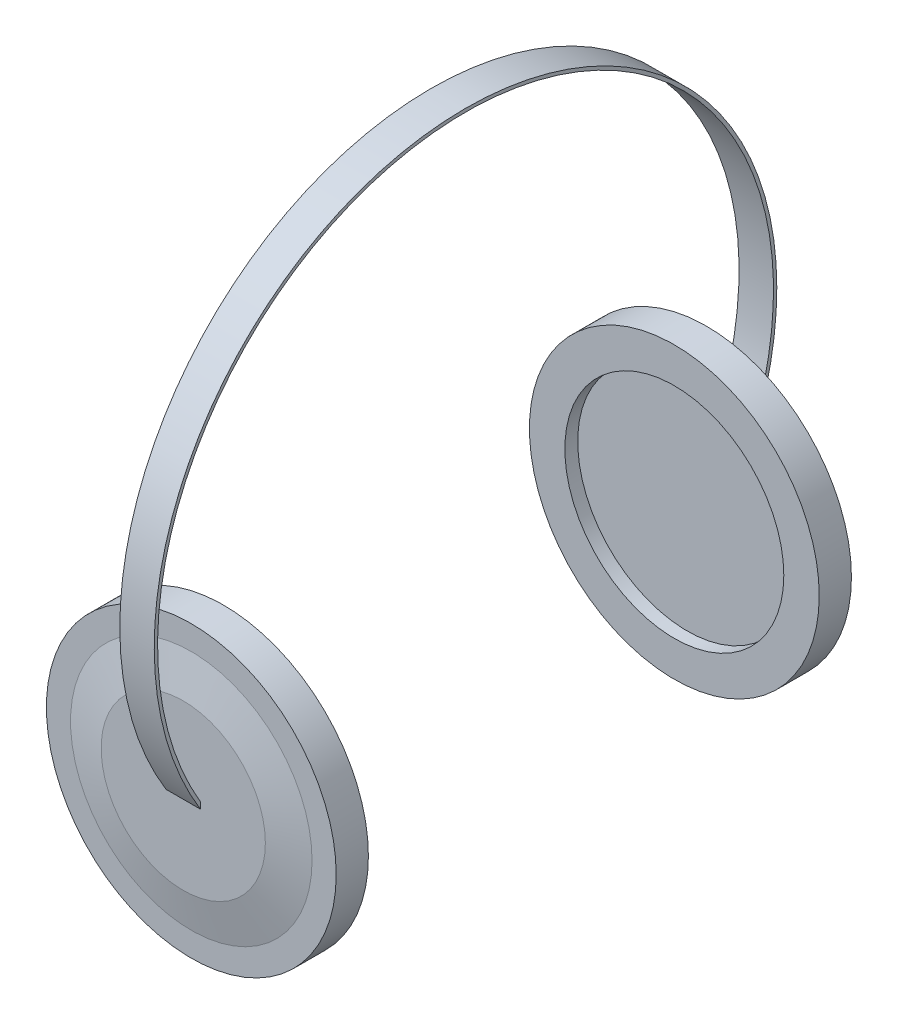
ISO-10303-21;
HEADER;
FILE_DESCRIPTION(('STEP AP214'),'2;1');
FILE_NAME('part.step','',(''),(''),'','','');
FILE_SCHEMA(('AUTOMOTIVE_DESIGN { 1 0 10303 214 1 1 1 1 }'));
ENDSEC;
DATA;
#1=APPLICATION_CONTEXT('core data for automotive mechanical design processes');
#2=APPLICATION_PROTOCOL_DEFINITION('international standard','automotive_design',2000,#1);
#3=PRODUCT_CONTEXT('',#1,'mechanical');
#4=PRODUCT('Part','Part','',(#3));
#5=PRODUCT_RELATED_PRODUCT_CATEGORY('part','',(#4));
#6=PRODUCT_DEFINITION_FORMATION('','',#4);
#7=PRODUCT_DEFINITION_CONTEXT('part definition',#1,'design');
#8=PRODUCT_DEFINITION('design','',#6,#7);
#9=PRODUCT_DEFINITION_SHAPE('','',#8);
#10=(LENGTH_UNIT() NAMED_UNIT(*) SI_UNIT(.MILLI.,.METRE.));
#11=(NAMED_UNIT(*) PLANE_ANGLE_UNIT() SI_UNIT($,.RADIAN.));
#12=(NAMED_UNIT(*) SI_UNIT($,.STERADIAN.) SOLID_ANGLE_UNIT());
#13=UNCERTAINTY_MEASURE_WITH_UNIT(LENGTH_MEASURE(1.E-05),#10,'distance_accuracy_value','');
#14=(GEOMETRIC_REPRESENTATION_CONTEXT(3) GLOBAL_UNCERTAINTY_ASSIGNED_CONTEXT((#13)) GLOBAL_UNIT_ASSIGNED_CONTEXT((#10,
#11,#12)) REPRESENTATION_CONTEXT('',''));
#15=CARTESIAN_POINT('',(0.,0.,0.));
#16=DIRECTION('',(0.,0.,1.));
#17=DIRECTION('',(1.,0.,0.));
#18=AXIS2_PLACEMENT_3D('',#15,#16,#17);
#19=CARTESIAN_POINT('',(0.,0.,320.));
#20=DIRECTION('',(0.,0.,1.));
#21=DIRECTION('',(1.,0.,0.));
#22=AXIS2_PLACEMENT_3D('',#19,#20,#21);
#23=PLANE('',#22);
#24=CARTESIAN_POINT('',(0.,0.,320.));
#25=DIRECTION('',(0.,0.,1.));
#26=DIRECTION('',(1.,0.,0.));
#27=AXIS2_PLACEMENT_3D('',#24,#25,#26);
#28=CIRCLE('',#27,90.);
#29=CARTESIAN_POINT('',(90.,0.,320.));
#30=VERTEX_POINT('',#29);
#31=EDGE_CURVE('E49',#30,#30,#28,.T.);
#32=ORIENTED_EDGE('',*,*,#31,.T.);
#33=EDGE_LOOP('',(#32));
#34=FACE_BOUND('',#33,.T.);
#35=CARTESIAN_POINT('',(0.,0.,320.));
#36=DIRECTION('',(0.,0.,1.));
#37=DIRECTION('',(1.,0.,0.));
#38=AXIS2_PLACEMENT_3D('',#35,#36,#37);
#39=CIRCLE('',#38,75.);
#40=CARTESIAN_POINT('',(75.,0.,320.));
#41=VERTEX_POINT('',#40);
#42=EDGE_CURVE('E117',#41,#41,#39,.T.);
#43=ORIENTED_EDGE('',*,*,#42,.F.);
#44=EDGE_LOOP('',(#43));
#45=FACE_BOUND('',#44,.T.);
#46=ADVANCED_FACE('F41',(#34,#45),#23,.T.);
#47=CARTESIAN_POINT('',(0.,0.,320.));
#48=DIRECTION('',(0.,0.,-1.));
#49=DIRECTION('',(-1.,0.,0.));
#50=AXIS2_PLACEMENT_3D('',#47,#48,#49);
#51=CYLINDRICAL_SURFACE('',#50,90.);
#52=ORIENTED_EDGE('',*,*,#31,.F.);
#53=EDGE_LOOP('',(#52));
#54=FACE_BOUND('',#53,.T.);
#55=CARTESIAN_POINT('',(0.,0.,300.));
#56=DIRECTION('',(0.,0.,1.));
#57=DIRECTION('',(1.,0.,0.));
#58=AXIS2_PLACEMENT_3D('',#55,#56,#57);
#59=CIRCLE('',#58,90.);
#60=CARTESIAN_POINT('',(90.,0.,300.));
#61=VERTEX_POINT('',#60);
#62=EDGE_CURVE('E154',#61,#61,#59,.T.);
#63=ORIENTED_EDGE('',*,*,#62,.T.);
#64=EDGE_LOOP('',(#63));
#65=FACE_BOUND('',#64,.T.);
#66=ADVANCED_FACE('F43',(#54,#65),#51,.T.);
#67=CARTESIAN_POINT('',(0.,0.,300.));
#68=DIRECTION('',(0.,0.,1.));
#69=DIRECTION('',(1.,0.,0.));
#70=AXIS2_PLACEMENT_3D('',#67,#68,#69);
#71=PLANE('',#70);
#72=CARTESIAN_POINT('',(0.,0.,300.));
#73=DIRECTION('',(0.,0.,-1.));
#74=DIRECTION('',(-1.,0.,0.));
#75=AXIS2_PLACEMENT_3D('',#72,#73,#74);
#76=CIRCLE('',#75,68.);
#77=CARTESIAN_POINT('',(-68.,0.,300.));
#78=VERTEX_POINT('',#77);
#79=EDGE_CURVE('E155',#78,#78,#76,.T.);
#80=ORIENTED_EDGE('',*,*,#79,.F.);
#81=EDGE_LOOP('',(#80));
#82=FACE_BOUND('',#81,.T.);
#83=ORIENTED_EDGE('',*,*,#62,.F.);
#84=EDGE_LOOP('',(#83));
#85=FACE_BOUND('',#84,.T.);
#86=ADVANCED_FACE('F163',(#82,#85),#71,.F.);
#87=CARTESIAN_POINT('',(0.,0.,308.));
#88=DIRECTION('',(0.,0.,-1.));
#89=DIRECTION('',(-1.,0.,0.));
#90=AXIS2_PLACEMENT_3D('',#87,#88,#89);
#91=CYLINDRICAL_SURFACE('',#90,68.);
#92=CARTESIAN_POINT('',(0.,0.,308.));
#93=DIRECTION('',(0.,0.,-1.));
#94=DIRECTION('',(-1.,0.,0.));
#95=AXIS2_PLACEMENT_3D('',#92,#93,#94);
#96=CIRCLE('',#95,68.);
#97=CARTESIAN_POINT('',(-68.,0.,308.));
#98=VERTEX_POINT('',#97);
#99=EDGE_CURVE('E151',#98,#98,#96,.T.);
#100=ORIENTED_EDGE('',*,*,#99,.F.);
#101=EDGE_LOOP('',(#100));
#102=FACE_BOUND('',#101,.T.);
#103=ORIENTED_EDGE('',*,*,#79,.T.);
#104=EDGE_LOOP('',(#103));
#105=FACE_BOUND('',#104,.T.);
#106=ADVANCED_FACE('F165',(#102,#105),#91,.F.);
#107=CARTESIAN_POINT('',(0.,0.,308.));
#108=DIRECTION('',(0.,0.,-1.));
#109=DIRECTION('',(-1.,0.,0.));
#110=AXIS2_PLACEMENT_3D('',#107,#108,#109);
#111=PLANE('',#110);
#112=ORIENTED_EDGE('',*,*,#99,.T.);
#113=EDGE_LOOP('',(#112));
#114=FACE_BOUND('',#113,.T.);
#115=ADVANCED_FACE('F136',(#114),#111,.T.);
#116=CARTESIAN_POINT('',(0.,0.,325.));
#117=DIRECTION('',(0.,0.,1.));
#118=DIRECTION('',(1.,0.,0.));
#119=AXIS2_PLACEMENT_3D('',#116,#117,#118);
#120=PLANE('',#119);
#121=DIRECTION('',(0.,1.,0.));
#122=VECTOR('',#121,1.);
#123=CARTESIAN_POINT('',(10.6940788791942,1.98959607054661,325.));
#124=LINE('',#123,#122);
#125=CARTESIAN_POINT('',(10.6940788791942,-1.98959607054661,325.));
#126=VERTEX_POINT('',#125);
#127=CARTESIAN_POINT('',(10.6940788791942,1.98959607054661,325.));
#128=VERTEX_POINT('',#127);
#129=EDGE_CURVE('E91',#126,#128,#124,.T.);
#130=ORIENTED_EDGE('',*,*,#129,.F.);
#131=DIRECTION('',(1.,0.,0.));
#132=VECTOR('',#131,1.);
#133=CARTESIAN_POINT('',(-10.6940788791942,-1.98959607054661,325.));
#134=LINE('',#133,#132);
#135=CARTESIAN_POINT('',(-10.6940788791942,-1.98959607054661,325.));
#136=VERTEX_POINT('',#135);
#137=EDGE_CURVE('E97',#136,#126,#134,.T.);
#138=ORIENTED_EDGE('',*,*,#137,.F.);
#139=DIRECTION('',(0.,-1.,0.));
#140=VECTOR('',#139,1.);
#141=CARTESIAN_POINT('',(-10.6940788791942,1.98959607054661,325.));
#142=LINE('',#141,#140);
#143=CARTESIAN_POINT('',(-10.6940788791942,1.98959607054661,325.));
#144=VERTEX_POINT('',#143);
#145=EDGE_CURVE('E102',#144,#136,#142,.T.);
#146=ORIENTED_EDGE('',*,*,#145,.F.);
#147=DIRECTION('',(-1.,0.,0.));
#148=VECTOR('',#147,1.);
#149=CARTESIAN_POINT('',(-10.6940788791942,1.98959607054661,325.));
#150=LINE('',#149,#148);
#151=EDGE_CURVE('E370',#128,#144,#150,.T.);
#152=ORIENTED_EDGE('',*,*,#151,.F.);
#153=EDGE_LOOP('',(#130,#138,#146,#152));
#154=FACE_BOUND('',#153,.T.);
#155=CARTESIAN_POINT('',(0.,0.,325.));
#156=DIRECTION('',(0.,0.,1.));
#157=DIRECTION('',(1.,0.,0.));
#158=AXIS2_PLACEMENT_3D('',#155,#156,#157);
#159=CIRCLE('',#158,51.);
#160=CARTESIAN_POINT('',(51.,0.,325.));
#161=VERTEX_POINT('',#160);
#162=EDGE_CURVE('E108',#161,#161,#159,.T.);
#163=ORIENTED_EDGE('',*,*,#162,.T.);
#164=EDGE_LOOP('',(#163));
#165=FACE_BOUND('',#164,.T.);
#166=ADVANCED_FACE('F129',(#154,#165),#120,.T.);
#167=CARTESIAN_POINT('',(0.,0.,325.));
#168=DIRECTION('',(0.,0.,-1.));
#169=DIRECTION('',(-1.,0.,0.));
#170=AXIS2_PLACEMENT_3D('',#167,#168,#169);
#171=CONICAL_SURFACE('',#170,51.,1.36540093760513);
#172=ORIENTED_EDGE('',*,*,#42,.T.);
#173=EDGE_LOOP('',(#172));
#174=FACE_BOUND('',#173,.T.);
#175=ORIENTED_EDGE('',*,*,#162,.F.);
#176=EDGE_LOOP('',(#175));
#177=FACE_BOUND('',#176,.T.);
#178=ADVANCED_FACE('F119',(#174,#177),#171,.T.);
#179=CARTESIAN_POINT('',(10.6940788791942,-15.0642184351652,7.11023898630959));
#180=DIRECTION('',(-1.,0.,0.));
#181=DIRECTION('',(0.,0.,1.));
#182=AXIS2_PLACEMENT_3D('',#179,#180,#181);
#183=PLANE('',#182);
#184=CARTESIAN_POINT('',(10.6940788791942,99.3761393207674,160.373186445737));
#185=DIRECTION('',(1.,0.,0.));
#186=DIRECTION('',(0.,0.,-1.));
#187=AXIS2_PLACEMENT_3D('',#184,#185,#186);
#188=CIRCLE('',#187,191.275002410815);
#189=CARTESIAN_POINT('',(10.6940788791942,3.26247873060695,-5.));
#190=VERTEX_POINT('',#189);
#191=EDGE_CURVE('E63',#190,#128,#188,.T.);
#192=ORIENTED_EDGE('',*,*,#191,.F.);
#193=DIRECTION('',(0.,-1.,0.));
#194=VECTOR('',#193,1.);
#195=CARTESIAN_POINT('',(10.6940788791942,-15.0642184351652,-5.));
#196=LINE('',#195,#194);
#197=CARTESIAN_POINT('',(10.6940788791942,-0.767304085355414,-5.));
#198=VERTEX_POINT('',#197);
#199=EDGE_CURVE('E82',#190,#198,#196,.T.);
#200=ORIENTED_EDGE('',*,*,#199,.T.);
#201=CARTESIAN_POINT('',(10.6940788791942,99.3761393207674,160.373186445737));
#202=DIRECTION('',(1.,0.,0.));
#203=DIRECTION('',(0.,0.,-1.));
#204=AXIS2_PLACEMENT_3D('',#201,#202,#203);
#205=CIRCLE('',#204,193.331321964269);
#206=EDGE_CURVE('E89',#198,#126,#205,.T.);
#207=ORIENTED_EDGE('',*,*,#206,.T.);
#208=ORIENTED_EDGE('',*,*,#129,.T.);
#209=EDGE_LOOP('',(#192,#200,#207,#208));
#210=FACE_BOUND('',#209,.T.);
#211=ADVANCED_FACE('F87',(#210),#183,.F.);
#212=CARTESIAN_POINT('',(0.,99.3761393207674,160.373186445737));
#213=DIRECTION('',(1.,0.,0.));
#214=DIRECTION('',(0.,0.,-1.));
#215=AXIS2_PLACEMENT_3D('',#212,#213,#214);
#216=CYLINDRICAL_SURFACE('',#215,191.275002410815);
#217=CARTESIAN_POINT('',(-10.6940788791942,99.3761393207674,160.373186445737));
#218=DIRECTION('',(1.,0.,0.));
#219=DIRECTION('',(0.,0.,-1.));
#220=AXIS2_PLACEMENT_3D('',#217,#218,#219);
#221=CIRCLE('',#220,191.275002410815);
#222=CARTESIAN_POINT('',(-10.6940788791942,3.26247873060695,-5.));
#223=VERTEX_POINT('',#222);
#224=EDGE_CURVE('E100',#223,#144,#221,.T.);
#225=ORIENTED_EDGE('',*,*,#224,.F.);
#226=DIRECTION('',(1.,0.,0.));
#227=VECTOR('',#226,1.);
#228=CARTESIAN_POINT('',(0.,3.26247873060695,-5.));
#229=LINE('',#228,#227);
#230=EDGE_CURVE('E92',#223,#190,#229,.T.);
#231=ORIENTED_EDGE('',*,*,#230,.T.);
#232=ORIENTED_EDGE('',*,*,#191,.T.);
#233=ORIENTED_EDGE('',*,*,#151,.T.);
#234=EDGE_LOOP('',(#225,#231,#232,#233));
#235=FACE_BOUND('',#234,.T.);
#236=ADVANCED_FACE('F131',(#235),#216,.F.);
#237=CARTESIAN_POINT('',(-10.6940788791942,-15.0642184351652,7.11023898630959));
#238=DIRECTION('',(1.,0.,0.));
#239=DIRECTION('',(0.,0.,-1.));
#240=AXIS2_PLACEMENT_3D('',#237,#238,#239);
#241=PLANE('',#240);
#242=CARTESIAN_POINT('',(-10.6940788791942,99.3761393207674,160.373186445737));
#243=DIRECTION('',(1.,0.,0.));
#244=DIRECTION('',(0.,0.,-1.));
#245=AXIS2_PLACEMENT_3D('',#242,#243,#244);
#246=CIRCLE('',#245,193.331321964269);
#247=CARTESIAN_POINT('',(-10.6940788791942,-0.767304085355414,-5.));
#248=VERTEX_POINT('',#247);
#249=EDGE_CURVE('E98',#248,#136,#246,.T.);
#250=ORIENTED_EDGE('',*,*,#249,.F.);
#251=DIRECTION('',(0.,1.,0.));
#252=VECTOR('',#251,1.);
#253=CARTESIAN_POINT('',(-10.6940788791942,-15.0642184351652,-5.));
#254=LINE('',#253,#252);
#255=EDGE_CURVE('E56',#248,#223,#254,.T.);
#256=ORIENTED_EDGE('',*,*,#255,.T.);
#257=ORIENTED_EDGE('',*,*,#224,.T.);
#258=ORIENTED_EDGE('',*,*,#145,.T.);
#259=EDGE_LOOP('',(#250,#256,#257,#258));
#260=FACE_BOUND('',#259,.T.);
#261=ADVANCED_FACE('F227',(#260),#241,.F.);
#262=CARTESIAN_POINT('',(0.,99.3761393207674,160.373186445737));
#263=DIRECTION('',(1.,0.,0.));
#264=DIRECTION('',(0.,0.,-1.));
#265=AXIS2_PLACEMENT_3D('',#262,#263,#264);
#266=CYLINDRICAL_SURFACE('',#265,193.331321964269);
#267=ORIENTED_EDGE('',*,*,#206,.F.);
#268=DIRECTION('',(1.,0.,0.));
#269=VECTOR('',#268,1.);
#270=CARTESIAN_POINT('',(0.,-0.767304085355414,-5.));
#271=LINE('',#270,#269);
#272=EDGE_CURVE('E12',#198,#248,#271,.F.);
#273=ORIENTED_EDGE('',*,*,#272,.T.);
#274=ORIENTED_EDGE('',*,*,#249,.T.);
#275=ORIENTED_EDGE('',*,*,#137,.T.);
#276=EDGE_LOOP('',(#267,#273,#274,#275));
#277=FACE_BOUND('',#276,.T.);
#278=ADVANCED_FACE('F95',(#277),#266,.T.);
#279=CARTESIAN_POINT('',(0.,0.,-5.));
#280=DIRECTION('',(0.,0.,-1.));
#281=DIRECTION('',(-1.,0.,0.));
#282=AXIS2_PLACEMENT_3D('',#279,#280,#281);
#283=PLANE('',#282);
#284=CARTESIAN_POINT('',(0.,0.,-5.));
#285=DIRECTION('',(0.,0.,-1.));
#286=DIRECTION('',(-1.,0.,0.));
#287=AXIS2_PLACEMENT_3D('',#284,#285,#286);
#288=CIRCLE('',#287,51.);
#289=CARTESIAN_POINT('',(-51.,0.,-5.));
#290=VERTEX_POINT('',#289);
#291=EDGE_CURVE('E342',#290,#290,#288,.T.);
#292=ORIENTED_EDGE('',*,*,#291,.T.);
#293=EDGE_LOOP('',(#292));
#294=FACE_BOUND('',#293,.T.);
#295=ORIENTED_EDGE('',*,*,#199,.F.);
#296=ORIENTED_EDGE('',*,*,#230,.F.);
#297=ORIENTED_EDGE('',*,*,#255,.F.);
#298=ORIENTED_EDGE('',*,*,#272,.F.);
#299=EDGE_LOOP('',(#295,#296,#297,#298));
#300=FACE_BOUND('',#299,.T.);
#301=ADVANCED_FACE('F81',(#294,#300),#283,.T.);
#302=CARTESIAN_POINT('',(0.,0.,20.));
#303=DIRECTION('',(0.,0.,-1.));
#304=DIRECTION('',(-1.,0.,0.));
#305=AXIS2_PLACEMENT_3D('',#302,#303,#304);
#306=CYLINDRICAL_SURFACE('',#305,90.);
#307=CARTESIAN_POINT('',(0.,0.,20.));
#308=DIRECTION('',(0.,0.,1.));
#309=DIRECTION('',(1.,0.,0.));
#310=AXIS2_PLACEMENT_3D('',#307,#308,#309);
#311=CIRCLE('',#310,90.);
#312=CARTESIAN_POINT('',(90.,0.,20.));
#313=VERTEX_POINT('',#312);
#314=EDGE_CURVE('E362',#313,#313,#311,.T.);
#315=ORIENTED_EDGE('',*,*,#314,.F.);
#316=EDGE_LOOP('',(#315));
#317=FACE_BOUND('',#316,.T.);
#318=CARTESIAN_POINT('',(0.,0.,0.));
#319=DIRECTION('',(0.,0.,1.));
#320=DIRECTION('',(1.,0.,0.));
#321=AXIS2_PLACEMENT_3D('',#318,#319,#320);
#322=CIRCLE('',#321,90.);
#323=CARTESIAN_POINT('',(90.,0.,0.));
#324=VERTEX_POINT('',#323);
#325=EDGE_CURVE('E359',#324,#324,#322,.T.);
#326=ORIENTED_EDGE('',*,*,#325,.T.);
#327=EDGE_LOOP('',(#326));
#328=FACE_BOUND('',#327,.T.);
#329=ADVANCED_FACE('F245',(#317,#328),#306,.T.);
#330=CARTESIAN_POINT('',(0.,0.,20.));
#331=DIRECTION('',(0.,0.,1.));
#332=DIRECTION('',(1.,0.,0.));
#333=AXIS2_PLACEMENT_3D('',#330,#331,#332);
#334=PLANE('',#333);
#335=CARTESIAN_POINT('',(0.,0.,20.));
#336=DIRECTION('',(0.,0.,1.));
#337=DIRECTION('',(1.,0.,0.));
#338=AXIS2_PLACEMENT_3D('',#335,#336,#337);
#339=CIRCLE('',#338,68.);
#340=CARTESIAN_POINT('',(68.,0.,20.));
#341=VERTEX_POINT('',#340);
#342=EDGE_CURVE('E341',#341,#341,#339,.T.);
#343=ORIENTED_EDGE('',*,*,#342,.F.);
#344=EDGE_LOOP('',(#343));
#345=FACE_BOUND('',#344,.T.);
#346=ORIENTED_EDGE('',*,*,#314,.T.);
#347=EDGE_LOOP('',(#346));
#348=FACE_BOUND('',#347,.T.);
#349=ADVANCED_FACE('F253',(#345,#348),#334,.T.);
#350=CARTESIAN_POINT('',(0.,0.,0.));
#351=DIRECTION('',(0.,0.,1.));
#352=DIRECTION('',(1.,0.,0.));
#353=AXIS2_PLACEMENT_3D('',#350,#351,#352);
#354=PLANE('',#353);
#355=CARTESIAN_POINT('',(0.,0.,0.));
#356=DIRECTION('',(0.,0.,-1.));
#357=DIRECTION('',(-1.,0.,0.));
#358=AXIS2_PLACEMENT_3D('',#355,#356,#357);
#359=CIRCLE('',#358,75.);
#360=CARTESIAN_POINT('',(-75.,0.,0.));
#361=VERTEX_POINT('',#360);
#362=EDGE_CURVE('E334',#361,#361,#359,.T.);
#363=ORIENTED_EDGE('',*,*,#362,.F.);
#364=EDGE_LOOP('',(#363));
#365=FACE_BOUND('',#364,.T.);
#366=ORIENTED_EDGE('',*,*,#325,.F.);
#367=EDGE_LOOP('',(#366));
#368=FACE_BOUND('',#367,.T.);
#369=ADVANCED_FACE('F261',(#365,#368),#354,.F.);
#370=CARTESIAN_POINT('',(0.,0.,12.));
#371=DIRECTION('',(0.,0.,1.));
#372=DIRECTION('',(1.,0.,0.));
#373=AXIS2_PLACEMENT_3D('',#370,#371,#372);
#374=CYLINDRICAL_SURFACE('',#373,68.);
#375=CARTESIAN_POINT('',(0.,0.,12.));
#376=DIRECTION('',(0.,0.,1.));
#377=DIRECTION('',(1.,0.,0.));
#378=AXIS2_PLACEMENT_3D('',#375,#376,#377);
#379=CIRCLE('',#378,68.);
#380=CARTESIAN_POINT('',(68.,0.,12.));
#381=VERTEX_POINT('',#380);
#382=EDGE_CURVE('E356',#381,#381,#379,.T.);
#383=ORIENTED_EDGE('',*,*,#382,.F.);
#384=EDGE_LOOP('',(#383));
#385=FACE_BOUND('',#384,.T.);
#386=ORIENTED_EDGE('',*,*,#342,.T.);
#387=EDGE_LOOP('',(#386));
#388=FACE_BOUND('',#387,.T.);
#389=ADVANCED_FACE('F269',(#385,#388),#374,.F.);
#390=CARTESIAN_POINT('',(0.,0.,12.));
#391=DIRECTION('',(0.,0.,1.));
#392=DIRECTION('',(1.,0.,0.));
#393=AXIS2_PLACEMENT_3D('',#390,#391,#392);
#394=PLANE('',#393);
#395=ORIENTED_EDGE('',*,*,#382,.T.);
#396=EDGE_LOOP('',(#395));
#397=FACE_BOUND('',#396,.T.);
#398=ADVANCED_FACE('F277',(#397),#394,.T.);
#399=CARTESIAN_POINT('',(0.,0.,-5.));
#400=DIRECTION('',(0.,0.,1.));
#401=DIRECTION('',(1.,0.,0.));
#402=AXIS2_PLACEMENT_3D('',#399,#400,#401);
#403=CONICAL_SURFACE('',#402,51.,1.36540093760513);
#404=ORIENTED_EDGE('',*,*,#362,.T.);
#405=EDGE_LOOP('',(#404));
#406=FACE_BOUND('',#405,.T.);
#407=ORIENTED_EDGE('',*,*,#291,.F.);
#408=EDGE_LOOP('',(#407));
#409=FACE_BOUND('',#408,.T.);
#410=ADVANCED_FACE('F285',(#406,#409),#403,.T.);
#411=CLOSED_SHELL('',(#46,#66,#86,#106,#115,#166,#178,#211,#236,#261,#278,#301,#329,#349,#369,
#389,#398,#410));
#412=MANIFOLD_SOLID_BREP('B2',#411);
#413=ADVANCED_BREP_SHAPE_REPRESENTATION('',(#18,#412),#14);
#414=SHAPE_DEFINITION_REPRESENTATION(#9,#413);
ENDSEC;
END-ISO-10303-21;
